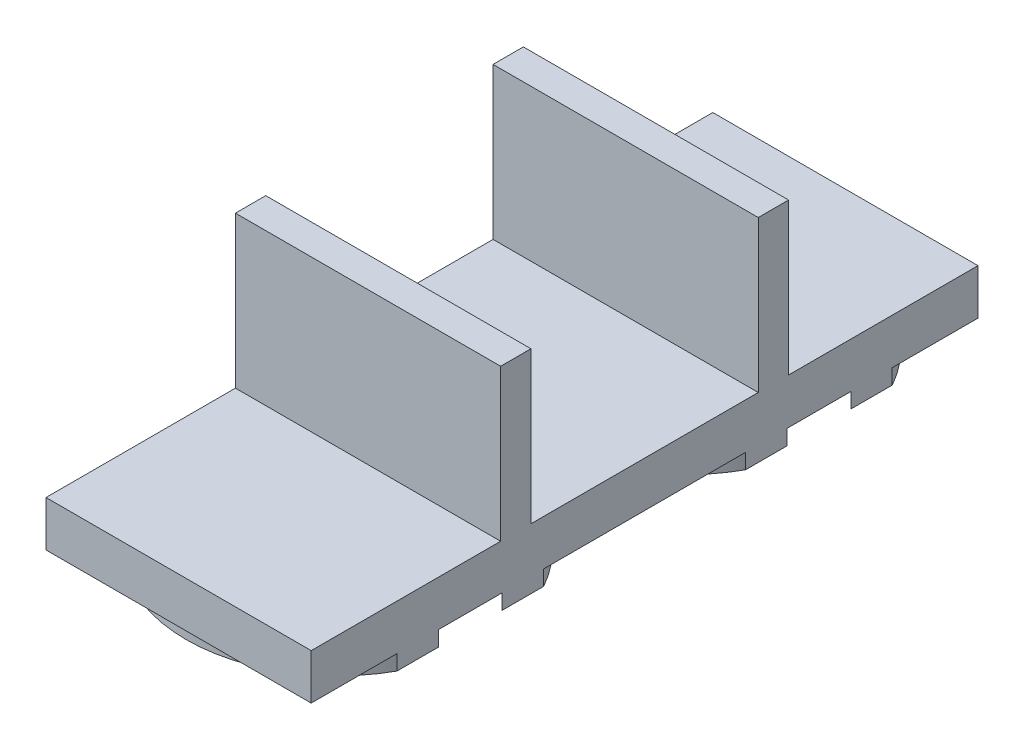
ISO-10303-21;
HEADER;
FILE_DESCRIPTION(('STEP AP214'),'2;1');
FILE_NAME('part.step','',(''),(''),'','','');
FILE_SCHEMA(('AUTOMOTIVE_DESIGN { 1 0 10303 214 1 1 1 1 }'));
ENDSEC;
DATA;
#1=APPLICATION_CONTEXT('core data for automotive mechanical design processes');
#2=APPLICATION_PROTOCOL_DEFINITION('international standard','automotive_design',2000,#1);
#3=PRODUCT_CONTEXT('',#1,'mechanical');
#4=PRODUCT('Part','Part','',(#3));
#5=PRODUCT_RELATED_PRODUCT_CATEGORY('part','',(#4));
#6=PRODUCT_DEFINITION_FORMATION('','',#4);
#7=PRODUCT_DEFINITION_CONTEXT('part definition',#1,'design');
#8=PRODUCT_DEFINITION('design','',#6,#7);
#9=PRODUCT_DEFINITION_SHAPE('','',#8);
#10=(LENGTH_UNIT() NAMED_UNIT(*) SI_UNIT(.MILLI.,.METRE.));
#11=(NAMED_UNIT(*) PLANE_ANGLE_UNIT() SI_UNIT($,.RADIAN.));
#12=(NAMED_UNIT(*) SI_UNIT($,.STERADIAN.) SOLID_ANGLE_UNIT());
#13=UNCERTAINTY_MEASURE_WITH_UNIT(LENGTH_MEASURE(1.E-05),#10,'distance_accuracy_value','');
#14=(GEOMETRIC_REPRESENTATION_CONTEXT(3) GLOBAL_UNCERTAINTY_ASSIGNED_CONTEXT((#13)) GLOBAL_UNIT_ASSIGNED_CONTEXT((#10,
#11,#12)) REPRESENTATION_CONTEXT('',''));
#15=CARTESIAN_POINT('',(0.,0.,0.));
#16=DIRECTION('',(0.,0.,1.));
#17=DIRECTION('',(1.,0.,0.));
#18=AXIS2_PLACEMENT_3D('',#15,#16,#17);
#19=CARTESIAN_POINT('',(35.,0.,44.));
#20=DIRECTION('',(0.,1.,0.));
#21=DIRECTION('',(0.,0.,1.));
#22=AXIS2_PLACEMENT_3D('',#19,#20,#21);
#23=PLANE('',#22);
#24=CARTESIAN_POINT('',(17.5,0.,-23.));
#25=DIRECTION('',(0.,-1.,0.));
#26=DIRECTION('',(0.,0.,-1.));
#27=AXIS2_PLACEMENT_3D('',#24,#25,#26);
#28=CIRCLE('',#27,20.);
#29=CARTESIAN_POINT('',(0.,0.,-32.6824583655186));
#30=VERTEX_POINT('',#29);
#31=CARTESIAN_POINT('',(35.,0.,-32.6824583655186));
#32=VERTEX_POINT('',#31);
#33=EDGE_CURVE('E417',#30,#32,#28,.T.);
#34=ORIENTED_EDGE('',*,*,#33,.F.);
#35=DIRECTION('',(0.,0.,-1.));
#36=VECTOR('',#35,1.);
#37=CARTESIAN_POINT('',(0.,0.,44.));
#38=LINE('',#37,#36);
#39=CARTESIAN_POINT('',(0.,0.,-44.));
#40=VERTEX_POINT('',#39);
#41=EDGE_CURVE('E247',#30,#40,#38,.T.);
#42=ORIENTED_EDGE('',*,*,#41,.T.);
#43=DIRECTION('',(-1.,0.,0.));
#44=VECTOR('',#43,1.);
#45=CARTESIAN_POINT('',(35.,0.,-44.));
#46=LINE('',#45,#44);
#47=CARTESIAN_POINT('',(35.,0.,-44.));
#48=VERTEX_POINT('',#47);
#49=EDGE_CURVE('E46',#48,#40,#46,.T.);
#50=ORIENTED_EDGE('',*,*,#49,.F.);
#51=DIRECTION('',(0.,0.,-1.));
#52=VECTOR('',#51,1.);
#53=CARTESIAN_POINT('',(35.,0.,44.));
#54=LINE('',#53,#52);
#55=EDGE_CURVE('E40',#32,#48,#54,.T.);
#56=ORIENTED_EDGE('',*,*,#55,.F.);
#57=EDGE_LOOP('',(#34,#42,#50,#56));
#58=FACE_BOUND('',#57,.T.);
#59=ADVANCED_FACE('F36',(#58),#23,.F.);
#60=CARTESIAN_POINT('',(17.5,0.,-23.));
#61=DIRECTION('',(0.,-1.,0.));
#62=DIRECTION('',(0.,0.,-1.));
#63=AXIS2_PLACEMENT_3D('',#60,#61,#62);
#64=CIRCLE('',#63,20.);
#65=CARTESIAN_POINT('',(35.,0.,-13.3175416344814));
#66=VERTEX_POINT('',#65);
#67=CARTESIAN_POINT('',(0.,0.,-13.3175416344814));
#68=VERTEX_POINT('',#67);
#69=EDGE_CURVE('E248',#66,#68,#64,.T.);
#70=ORIENTED_EDGE('',*,*,#69,.F.);
#71=CARTESIAN_POINT('',(35.,0.,13.3175416344814));
#72=VERTEX_POINT('',#71);
#73=EDGE_CURVE('E357',#72,#66,#54,.T.);
#74=ORIENTED_EDGE('',*,*,#73,.F.);
#75=CARTESIAN_POINT('',(17.5,0.,23.));
#76=DIRECTION('',(0.,-1.,0.));
#77=DIRECTION('',(0.,0.,-1.));
#78=AXIS2_PLACEMENT_3D('',#75,#76,#77);
#79=CIRCLE('',#78,20.);
#80=CARTESIAN_POINT('',(0.,0.,13.3175416344814));
#81=VERTEX_POINT('',#80);
#82=EDGE_CURVE('E281',#81,#72,#79,.T.);
#83=ORIENTED_EDGE('',*,*,#82,.F.);
#84=EDGE_CURVE('E352',#81,#68,#38,.T.);
#85=ORIENTED_EDGE('',*,*,#84,.T.);
#86=EDGE_LOOP('',(#70,#74,#83,#85));
#87=FACE_BOUND('',#86,.T.);
#88=ADVANCED_FACE('F540',(#87),#23,.F.);
#89=CARTESIAN_POINT('',(0.,0.,-18.7869251134118));
#90=VERTEX_POINT('',#89);
#91=CARTESIAN_POINT('',(0.,0.,-27.2130748865882));
#92=VERTEX_POINT('',#91);
#93=EDGE_CURVE('E356',#90,#92,#38,.T.);
#94=ORIENTED_EDGE('',*,*,#93,.T.);
#95=CARTESIAN_POINT('',(17.5,0.,-23.));
#96=DIRECTION('',(0.,-1.,0.));
#97=DIRECTION('',(0.,0.,-1.));
#98=AXIS2_PLACEMENT_3D('',#95,#96,#97);
#99=CIRCLE('',#98,18.);
#100=CARTESIAN_POINT('',(35.,0.,-27.2130748865882));
#101=VERTEX_POINT('',#100);
#102=EDGE_CURVE('E61',#92,#101,#99,.T.);
#103=ORIENTED_EDGE('',*,*,#102,.T.);
#104=CARTESIAN_POINT('',(35.,0.,-18.7869251134118));
#105=VERTEX_POINT('',#104);
#106=EDGE_CURVE('E373',#105,#101,#54,.T.);
#107=ORIENTED_EDGE('',*,*,#106,.F.);
#108=CARTESIAN_POINT('',(17.5,0.,-23.));
#109=DIRECTION('',(0.,-1.,0.));
#110=DIRECTION('',(0.,0.,-1.));
#111=AXIS2_PLACEMENT_3D('',#108,#109,#110);
#112=CIRCLE('',#111,18.);
#113=EDGE_CURVE('E251',#105,#90,#112,.T.);
#114=ORIENTED_EDGE('',*,*,#113,.T.);
#115=EDGE_LOOP('',(#94,#103,#107,#114));
#116=FACE_BOUND('',#115,.T.);
#117=ADVANCED_FACE('F412',(#116),#23,.F.);
#118=CARTESIAN_POINT('',(17.5,0.,23.));
#119=DIRECTION('',(0.,-1.,0.));
#120=DIRECTION('',(0.,0.,-1.));
#121=AXIS2_PLACEMENT_3D('',#118,#119,#120);
#122=CIRCLE('',#121,20.);
#123=CARTESIAN_POINT('',(35.,0.,32.6824583655186));
#124=VERTEX_POINT('',#123);
#125=CARTESIAN_POINT('',(0.,0.,32.6824583655186));
#126=VERTEX_POINT('',#125);
#127=EDGE_CURVE('E308',#124,#126,#122,.T.);
#128=ORIENTED_EDGE('',*,*,#127,.F.);
#129=CARTESIAN_POINT('',(35.,0.,44.));
#130=VERTEX_POINT('',#129);
#131=EDGE_CURVE('E383',#130,#124,#54,.T.);
#132=ORIENTED_EDGE('',*,*,#131,.F.);
#133=DIRECTION('',(-1.,0.,0.));
#134=VECTOR('',#133,1.);
#135=CARTESIAN_POINT('',(35.,0.,44.));
#136=LINE('',#135,#134);
#137=CARTESIAN_POINT('',(0.,0.,44.));
#138=VERTEX_POINT('',#137);
#139=EDGE_CURVE('E11',#130,#138,#136,.T.);
#140=ORIENTED_EDGE('',*,*,#139,.T.);
#141=EDGE_CURVE('E371',#138,#126,#38,.T.);
#142=ORIENTED_EDGE('',*,*,#141,.T.);
#143=EDGE_LOOP('',(#128,#132,#140,#142));
#144=FACE_BOUND('',#143,.T.);
#145=ADVANCED_FACE('F514',(#144),#23,.F.);
#146=CARTESIAN_POINT('',(35.,6.,44.));
#147=DIRECTION('',(0.,0.,-1.));
#148=DIRECTION('',(-1.,0.,0.));
#149=AXIS2_PLACEMENT_3D('',#146,#147,#148);
#150=PLANE('',#149);
#151=DIRECTION('',(0.,-1.,0.));
#152=VECTOR('',#151,1.);
#153=CARTESIAN_POINT('',(0.,6.,44.));
#154=LINE('',#153,#152);
#155=CARTESIAN_POINT('',(0.,6.,44.));
#156=VERTEX_POINT('',#155);
#157=EDGE_CURVE('E340',#156,#138,#154,.T.);
#158=ORIENTED_EDGE('',*,*,#157,.T.);
#159=ORIENTED_EDGE('',*,*,#139,.F.);
#160=DIRECTION('',(0.,-1.,0.));
#161=VECTOR('',#160,1.);
#162=CARTESIAN_POINT('',(35.,6.,44.));
#163=LINE('',#162,#161);
#164=CARTESIAN_POINT('',(35.,6.,44.));
#165=VERTEX_POINT('',#164);
#166=EDGE_CURVE('E376',#165,#130,#163,.T.);
#167=ORIENTED_EDGE('',*,*,#166,.F.);
#168=DIRECTION('',(-1.,0.,0.));
#169=VECTOR('',#168,1.);
#170=CARTESIAN_POINT('',(35.,6.,44.));
#171=LINE('',#170,#169);
#172=EDGE_CURVE('E454',#165,#156,#171,.T.);
#173=ORIENTED_EDGE('',*,*,#172,.T.);
#174=EDGE_LOOP('',(#158,#159,#167,#173));
#175=FACE_BOUND('',#174,.T.);
#176=ADVANCED_FACE('F38',(#175),#150,.F.);
#177=CARTESIAN_POINT('',(0.,0.,27.2130748865883));
#178=VERTEX_POINT('',#177);
#179=CARTESIAN_POINT('',(0.,0.,18.7869251134117));
#180=VERTEX_POINT('',#179);
#181=EDGE_CURVE('E355',#178,#180,#38,.T.);
#182=ORIENTED_EDGE('',*,*,#181,.T.);
#183=CARTESIAN_POINT('',(17.5,0.,23.));
#184=DIRECTION('',(0.,-1.,0.));
#185=DIRECTION('',(0.,0.,-1.));
#186=AXIS2_PLACEMENT_3D('',#183,#184,#185);
#187=CIRCLE('',#186,18.);
#188=CARTESIAN_POINT('',(35.,0.,18.7869251134117));
#189=VERTEX_POINT('',#188);
#190=EDGE_CURVE('E286',#180,#189,#187,.T.);
#191=ORIENTED_EDGE('',*,*,#190,.T.);
#192=CARTESIAN_POINT('',(35.,0.,27.2130748865883));
#193=VERTEX_POINT('',#192);
#194=EDGE_CURVE('E329',#193,#189,#54,.T.);
#195=ORIENTED_EDGE('',*,*,#194,.F.);
#196=CARTESIAN_POINT('',(17.5,0.,23.));
#197=DIRECTION('',(0.,-1.,0.));
#198=DIRECTION('',(0.,0.,-1.));
#199=AXIS2_PLACEMENT_3D('',#196,#197,#198);
#200=CIRCLE('',#199,18.);
#201=EDGE_CURVE('E313',#193,#178,#200,.T.);
#202=ORIENTED_EDGE('',*,*,#201,.T.);
#203=EDGE_LOOP('',(#182,#191,#195,#202));
#204=FACE_BOUND('',#203,.T.);
#205=ADVANCED_FACE('F529',(#204),#23,.F.);
#206=CARTESIAN_POINT('',(35.,0.,-44.));
#207=DIRECTION('',(0.,0.,1.));
#208=DIRECTION('',(1.,0.,0.));
#209=AXIS2_PLACEMENT_3D('',#206,#207,#208);
#210=PLANE('',#209);
#211=DIRECTION('',(0.,1.,0.));
#212=VECTOR('',#211,1.);
#213=CARTESIAN_POINT('',(0.,0.,-44.));
#214=LINE('',#213,#212);
#215=CARTESIAN_POINT('',(0.,6.00000000000002,-44.));
#216=VERTEX_POINT('',#215);
#217=EDGE_CURVE('E363',#40,#216,#214,.T.);
#218=ORIENTED_EDGE('',*,*,#217,.T.);
#219=DIRECTION('',(-1.,0.,0.));
#220=VECTOR('',#219,1.);
#221=CARTESIAN_POINT('',(35.,6.00000000000002,-44.));
#222=LINE('',#221,#220);
#223=CARTESIAN_POINT('',(35.,6.00000000000002,-44.));
#224=VERTEX_POINT('',#223);
#225=EDGE_CURVE('E426',#224,#216,#222,.T.);
#226=ORIENTED_EDGE('',*,*,#225,.F.);
#227=DIRECTION('',(0.,1.,0.));
#228=VECTOR('',#227,1.);
#229=CARTESIAN_POINT('',(35.,0.,-44.));
#230=LINE('',#229,#228);
#231=EDGE_CURVE('E377',#48,#224,#230,.T.);
#232=ORIENTED_EDGE('',*,*,#231,.F.);
#233=ORIENTED_EDGE('',*,*,#49,.T.);
#234=EDGE_LOOP('',(#218,#226,#232,#233));
#235=FACE_BOUND('',#234,.T.);
#236=ADVANCED_FACE('F428',(#235),#210,.F.);
#237=CARTESIAN_POINT('',(35.,6.00000000000002,-44.));
#238=DIRECTION('',(0.,-1.,0.));
#239=DIRECTION('',(0.,0.,-1.));
#240=AXIS2_PLACEMENT_3D('',#237,#238,#239);
#241=PLANE('',#240);
#242=DIRECTION('',(0.,0.,1.));
#243=VECTOR('',#242,1.);
#244=CARTESIAN_POINT('',(0.,6.00000000000002,-44.));
#245=LINE('',#244,#243);
#246=CARTESIAN_POINT('',(0.,6.00000000000001,-19.));
#247=VERTEX_POINT('',#246);
#248=EDGE_CURVE('E493',#216,#247,#245,.T.);
#249=ORIENTED_EDGE('',*,*,#248,.T.);
#250=DIRECTION('',(-1.,0.,0.));
#251=VECTOR('',#250,1.);
#252=CARTESIAN_POINT('',(35.,6.00000000000001,-19.));
#253=LINE('',#252,#251);
#254=CARTESIAN_POINT('',(35.,6.00000000000001,-19.));
#255=VERTEX_POINT('',#254);
#256=EDGE_CURVE('E433',#255,#247,#253,.T.);
#257=ORIENTED_EDGE('',*,*,#256,.F.);
#258=DIRECTION('',(0.,0.,1.));
#259=VECTOR('',#258,1.);
#260=CARTESIAN_POINT('',(35.,6.00000000000002,-44.));
#261=LINE('',#260,#259);
#262=EDGE_CURVE('E388',#224,#255,#261,.T.);
#263=ORIENTED_EDGE('',*,*,#262,.F.);
#264=ORIENTED_EDGE('',*,*,#225,.T.);
#265=EDGE_LOOP('',(#249,#257,#263,#264));
#266=FACE_BOUND('',#265,.T.);
#267=ADVANCED_FACE('F436',(#266),#241,.F.);
#268=CARTESIAN_POINT('',(35.,6.00000000000001,-19.));
#269=DIRECTION('',(0.,0.,1.));
#270=DIRECTION('',(0.,-1.,0.));
#271=AXIS2_PLACEMENT_3D('',#268,#269,#270);
#272=PLANE('',#271);
#273=DIRECTION('',(0.,1.,0.));
#274=VECTOR('',#273,1.);
#275=CARTESIAN_POINT('',(0.,6.00000000000001,-19.));
#276=LINE('',#275,#274);
#277=CARTESIAN_POINT('',(0.,26.,-19.));
#278=VERTEX_POINT('',#277);
#279=EDGE_CURVE('E491',#247,#278,#276,.T.);
#280=ORIENTED_EDGE('',*,*,#279,.T.);
#281=DIRECTION('',(-1.,0.,0.));
#282=VECTOR('',#281,1.);
#283=CARTESIAN_POINT('',(35.,26.,-19.));
#284=LINE('',#283,#282);
#285=CARTESIAN_POINT('',(35.,26.,-19.));
#286=VERTEX_POINT('',#285);
#287=EDGE_CURVE('E484',#286,#278,#284,.T.);
#288=ORIENTED_EDGE('',*,*,#287,.F.);
#289=DIRECTION('',(0.,1.,0.));
#290=VECTOR('',#289,1.);
#291=CARTESIAN_POINT('',(35.,6.00000000000001,-19.));
#292=LINE('',#291,#290);
#293=EDGE_CURVE('E439',#255,#286,#292,.T.);
#294=ORIENTED_EDGE('',*,*,#293,.F.);
#295=ORIENTED_EDGE('',*,*,#256,.T.);
#296=EDGE_LOOP('',(#280,#288,#294,#295));
#297=FACE_BOUND('',#296,.T.);
#298=ADVANCED_FACE('F489',(#297),#272,.F.);
#299=CARTESIAN_POINT('',(35.,26.,-19.));
#300=DIRECTION('',(0.,-1.,0.));
#301=DIRECTION('',(0.,0.,-1.));
#302=AXIS2_PLACEMENT_3D('',#299,#300,#301);
#303=PLANE('',#302);
#304=DIRECTION('',(0.,0.,1.));
#305=VECTOR('',#304,1.);
#306=CARTESIAN_POINT('',(0.,26.,-19.));
#307=LINE('',#306,#305);
#308=CARTESIAN_POINT('',(0.,26.,-15.));
#309=VERTEX_POINT('',#308);
#310=EDGE_CURVE('E495',#278,#309,#307,.T.);
#311=ORIENTED_EDGE('',*,*,#310,.T.);
#312=DIRECTION('',(-1.,0.,0.));
#313=VECTOR('',#312,1.);
#314=CARTESIAN_POINT('',(35.,26.,-15.));
#315=LINE('',#314,#313);
#316=CARTESIAN_POINT('',(35.,26.,-15.));
#317=VERTEX_POINT('',#316);
#318=EDGE_CURVE('E481',#317,#309,#315,.T.);
#319=ORIENTED_EDGE('',*,*,#318,.F.);
#320=DIRECTION('',(0.,0.,1.));
#321=VECTOR('',#320,1.);
#322=CARTESIAN_POINT('',(35.,26.,-19.));
#323=LINE('',#322,#321);
#324=EDGE_CURVE('E440',#286,#317,#323,.T.);
#325=ORIENTED_EDGE('',*,*,#324,.F.);
#326=ORIENTED_EDGE('',*,*,#287,.T.);
#327=EDGE_LOOP('',(#311,#319,#325,#326));
#328=FACE_BOUND('',#327,.T.);
#329=ADVANCED_FACE('F554',(#328),#303,.F.);
#330=CARTESIAN_POINT('',(35.,26.,-15.));
#331=DIRECTION('',(0.,0.,-1.));
#332=DIRECTION('',(0.,1.,0.));
#333=AXIS2_PLACEMENT_3D('',#330,#331,#332);
#334=PLANE('',#333);
#335=DIRECTION('',(0.,-1.,0.));
#336=VECTOR('',#335,1.);
#337=CARTESIAN_POINT('',(0.,26.,-15.));
#338=LINE('',#337,#336);
#339=CARTESIAN_POINT('',(0.,6.,-15.));
#340=VERTEX_POINT('',#339);
#341=EDGE_CURVE('E497',#309,#340,#338,.T.);
#342=ORIENTED_EDGE('',*,*,#341,.T.);
#343=DIRECTION('',(-1.,0.,0.));
#344=VECTOR('',#343,1.);
#345=CARTESIAN_POINT('',(35.,6.,-15.));
#346=LINE('',#345,#344);
#347=CARTESIAN_POINT('',(35.,6.,-15.));
#348=VERTEX_POINT('',#347);
#349=EDGE_CURVE('E478',#348,#340,#346,.T.);
#350=ORIENTED_EDGE('',*,*,#349,.F.);
#351=DIRECTION('',(0.,-1.,0.));
#352=VECTOR('',#351,1.);
#353=CARTESIAN_POINT('',(35.,26.,-15.));
#354=LINE('',#353,#352);
#355=EDGE_CURVE('E444',#317,#348,#354,.T.);
#356=ORIENTED_EDGE('',*,*,#355,.F.);
#357=ORIENTED_EDGE('',*,*,#318,.T.);
#358=EDGE_LOOP('',(#342,#350,#356,#357));
#359=FACE_BOUND('',#358,.T.);
#360=ADVANCED_FACE('F557',(#359),#334,.F.);
#361=CARTESIAN_POINT('',(35.,6.,-15.));
#362=DIRECTION('',(0.,-1.,0.));
#363=DIRECTION('',(0.,0.,-1.));
#364=AXIS2_PLACEMENT_3D('',#361,#362,#363);
#365=PLANE('',#364);
#366=DIRECTION('',(0.,0.,1.));
#367=VECTOR('',#366,1.);
#368=CARTESIAN_POINT('',(0.,6.,-15.));
#369=LINE('',#368,#367);
#370=CARTESIAN_POINT('',(0.,6.,15.));
#371=VERTEX_POINT('',#370);
#372=EDGE_CURVE('E501',#340,#371,#369,.T.);
#373=ORIENTED_EDGE('',*,*,#372,.T.);
#374=DIRECTION('',(-1.,0.,0.));
#375=VECTOR('',#374,1.);
#376=CARTESIAN_POINT('',(35.,6.,15.));
#377=LINE('',#376,#375);
#378=CARTESIAN_POINT('',(35.,6.,15.));
#379=VERTEX_POINT('',#378);
#380=EDGE_CURVE('E475',#379,#371,#377,.T.);
#381=ORIENTED_EDGE('',*,*,#380,.F.);
#382=DIRECTION('',(0.,0.,1.));
#383=VECTOR('',#382,1.);
#384=CARTESIAN_POINT('',(35.,6.,-15.));
#385=LINE('',#384,#383);
#386=EDGE_CURVE('E446',#348,#379,#385,.T.);
#387=ORIENTED_EDGE('',*,*,#386,.F.);
#388=ORIENTED_EDGE('',*,*,#349,.T.);
#389=EDGE_LOOP('',(#373,#381,#387,#388));
#390=FACE_BOUND('',#389,.T.);
#391=ADVANCED_FACE('F561',(#390),#365,.F.);
#392=CARTESIAN_POINT('',(35.,6.,15.));
#393=DIRECTION('',(0.,0.,1.));
#394=DIRECTION('',(0.,-1.,0.));
#395=AXIS2_PLACEMENT_3D('',#392,#393,#394);
#396=PLANE('',#395);
#397=DIRECTION('',(0.,1.,0.));
#398=VECTOR('',#397,1.);
#399=CARTESIAN_POINT('',(0.,6.,15.));
#400=LINE('',#399,#398);
#401=CARTESIAN_POINT('',(0.,26.,15.));
#402=VERTEX_POINT('',#401);
#403=EDGE_CURVE('E503',#371,#402,#400,.T.);
#404=ORIENTED_EDGE('',*,*,#403,.T.);
#405=DIRECTION('',(-1.,0.,0.));
#406=VECTOR('',#405,1.);
#407=CARTESIAN_POINT('',(35.,26.,15.));
#408=LINE('',#407,#406);
#409=CARTESIAN_POINT('',(35.,26.,15.));
#410=VERTEX_POINT('',#409);
#411=EDGE_CURVE('E472',#410,#402,#408,.T.);
#412=ORIENTED_EDGE('',*,*,#411,.F.);
#413=DIRECTION('',(0.,1.,0.));
#414=VECTOR('',#413,1.);
#415=CARTESIAN_POINT('',(35.,6.,15.));
#416=LINE('',#415,#414);
#417=EDGE_CURVE('E448',#379,#410,#416,.T.);
#418=ORIENTED_EDGE('',*,*,#417,.F.);
#419=ORIENTED_EDGE('',*,*,#380,.T.);
#420=EDGE_LOOP('',(#404,#412,#418,#419));
#421=FACE_BOUND('',#420,.T.);
#422=ADVANCED_FACE('F565',(#421),#396,.F.);
#423=CARTESIAN_POINT('',(35.,26.,15.));
#424=DIRECTION('',(0.,-1.,0.));
#425=DIRECTION('',(0.,0.,-1.));
#426=AXIS2_PLACEMENT_3D('',#423,#424,#425);
#427=PLANE('',#426);
#428=DIRECTION('',(0.,0.,1.));
#429=VECTOR('',#428,1.);
#430=CARTESIAN_POINT('',(0.,26.,15.));
#431=LINE('',#430,#429);
#432=CARTESIAN_POINT('',(0.,26.,19.));
#433=VERTEX_POINT('',#432);
#434=EDGE_CURVE('E505',#402,#433,#431,.T.);
#435=ORIENTED_EDGE('',*,*,#434,.T.);
#436=DIRECTION('',(-1.,0.,0.));
#437=VECTOR('',#436,1.);
#438=CARTESIAN_POINT('',(35.,26.,19.));
#439=LINE('',#438,#437);
#440=CARTESIAN_POINT('',(35.,26.,19.));
#441=VERTEX_POINT('',#440);
#442=EDGE_CURVE('E464',#441,#433,#439,.T.);
#443=ORIENTED_EDGE('',*,*,#442,.F.);
#444=DIRECTION('',(0.,0.,1.));
#445=VECTOR('',#444,1.);
#446=CARTESIAN_POINT('',(35.,26.,15.));
#447=LINE('',#446,#445);
#448=EDGE_CURVE('E450',#410,#441,#447,.T.);
#449=ORIENTED_EDGE('',*,*,#448,.F.);
#450=ORIENTED_EDGE('',*,*,#411,.T.);
#451=EDGE_LOOP('',(#435,#443,#449,#450));
#452=FACE_BOUND('',#451,.T.);
#453=ADVANCED_FACE('F569',(#452),#427,.F.);
#454=CARTESIAN_POINT('',(35.,26.,19.));
#455=DIRECTION('',(0.,0.,-1.));
#456=DIRECTION('',(0.,1.,0.));
#457=AXIS2_PLACEMENT_3D('',#454,#455,#456);
#458=PLANE('',#457);
#459=DIRECTION('',(0.,-1.,0.));
#460=VECTOR('',#459,1.);
#461=CARTESIAN_POINT('',(0.,26.,19.));
#462=LINE('',#461,#460);
#463=CARTESIAN_POINT('',(0.,6.,19.));
#464=VERTEX_POINT('',#463);
#465=EDGE_CURVE('E506',#433,#464,#462,.T.);
#466=ORIENTED_EDGE('',*,*,#465,.T.);
#467=DIRECTION('',(-1.,0.,0.));
#468=VECTOR('',#467,1.);
#469=CARTESIAN_POINT('',(35.,6.,19.));
#470=LINE('',#469,#468);
#471=CARTESIAN_POINT('',(35.,6.,19.));
#472=VERTEX_POINT('',#471);
#473=EDGE_CURVE('E458',#472,#464,#470,.T.);
#474=ORIENTED_EDGE('',*,*,#473,.F.);
#475=DIRECTION('',(0.,-1.,0.));
#476=VECTOR('',#475,1.);
#477=CARTESIAN_POINT('',(35.,26.,19.));
#478=LINE('',#477,#476);
#479=EDGE_CURVE('E452',#441,#472,#478,.T.);
#480=ORIENTED_EDGE('',*,*,#479,.F.);
#481=ORIENTED_EDGE('',*,*,#442,.T.);
#482=EDGE_LOOP('',(#466,#474,#480,#481));
#483=FACE_BOUND('',#482,.T.);
#484=ADVANCED_FACE('F573',(#483),#458,.F.);
#485=CARTESIAN_POINT('',(35.,6.,19.));
#486=DIRECTION('',(0.,-1.,0.));
#487=DIRECTION('',(0.,0.,-1.));
#488=AXIS2_PLACEMENT_3D('',#485,#486,#487);
#489=PLANE('',#488);
#490=DIRECTION('',(0.,0.,1.));
#491=VECTOR('',#490,1.);
#492=CARTESIAN_POINT('',(0.,6.,19.));
#493=LINE('',#492,#491);
#494=EDGE_CURVE('E467',#464,#156,#493,.T.);
#495=ORIENTED_EDGE('',*,*,#494,.T.);
#496=ORIENTED_EDGE('',*,*,#172,.F.);
#497=DIRECTION('',(0.,0.,1.));
#498=VECTOR('',#497,1.);
#499=CARTESIAN_POINT('',(35.,6.,19.));
#500=LINE('',#499,#498);
#501=EDGE_CURVE('E453',#472,#165,#500,.T.);
#502=ORIENTED_EDGE('',*,*,#501,.F.);
#503=ORIENTED_EDGE('',*,*,#473,.T.);
#504=EDGE_LOOP('',(#495,#496,#502,#503));
#505=FACE_BOUND('',#504,.T.);
#506=ADVANCED_FACE('F577',(#505),#489,.F.);
#507=CARTESIAN_POINT('',(35.,0.,0.));
#508=DIRECTION('',(1.,0.,0.));
#509=DIRECTION('',(0.,0.,-1.));
#510=AXIS2_PLACEMENT_3D('',#507,#508,#509);
#511=PLANE('',#510);
#512=ORIENTED_EDGE('',*,*,#166,.T.);
#513=ORIENTED_EDGE('',*,*,#131,.T.);
#514=DIRECTION('',(0.,1.,0.));
#515=VECTOR('',#514,1.);
#516=CARTESIAN_POINT('',(35.,-2.,32.6824583655186));
#517=LINE('',#516,#515);
#518=CARTESIAN_POINT('',(35.,-2.,32.6824583655186));
#519=VERTEX_POINT('',#518);
#520=EDGE_CURVE('E334',#519,#124,#517,.T.);
#521=ORIENTED_EDGE('',*,*,#520,.F.);
#522=DIRECTION('',(0.,0.,1.));
#523=VECTOR('',#522,1.);
#524=CARTESIAN_POINT('',(35.,-2.,0.));
#525=LINE('',#524,#523);
#526=CARTESIAN_POINT('',(35.,-2.,27.2130748865883));
#527=VERTEX_POINT('',#526);
#528=EDGE_CURVE('E309',#527,#519,#525,.T.);
#529=ORIENTED_EDGE('',*,*,#528,.F.);
#530=DIRECTION('',(0.,1.,0.));
#531=VECTOR('',#530,1.);
#532=CARTESIAN_POINT('',(35.,-2.,27.2130748865883));
#533=LINE('',#532,#531);
#534=EDGE_CURVE('E320',#527,#193,#533,.T.);
#535=ORIENTED_EDGE('',*,*,#534,.T.);
#536=ORIENTED_EDGE('',*,*,#194,.T.);
#537=DIRECTION('',(0.,1.,0.));
#538=VECTOR('',#537,1.);
#539=CARTESIAN_POINT('',(35.,-2.,18.7869251134117));
#540=LINE('',#539,#538);
#541=CARTESIAN_POINT('',(35.,-2.,18.7869251134117));
#542=VERTEX_POINT('',#541);
#543=EDGE_CURVE('E299',#542,#189,#540,.T.);
#544=ORIENTED_EDGE('',*,*,#543,.F.);
#545=DIRECTION('',(0.,0.,1.));
#546=VECTOR('',#545,1.);
#547=CARTESIAN_POINT('',(35.,-2.,0.));
#548=LINE('',#547,#546);
#549=CARTESIAN_POINT('',(35.,-2.,13.3175416344814));
#550=VERTEX_POINT('',#549);
#551=EDGE_CURVE('E288',#550,#542,#548,.T.);
#552=ORIENTED_EDGE('',*,*,#551,.F.);
#553=DIRECTION('',(0.,1.,0.));
#554=VECTOR('',#553,1.);
#555=CARTESIAN_POINT('',(35.,-2.,13.3175416344814));
#556=LINE('',#555,#554);
#557=EDGE_CURVE('E302',#550,#72,#556,.T.);
#558=ORIENTED_EDGE('',*,*,#557,.T.);
#559=ORIENTED_EDGE('',*,*,#73,.T.);
#560=DIRECTION('',(0.,1.,0.));
#561=VECTOR('',#560,1.);
#562=CARTESIAN_POINT('',(35.,-2.,-13.3175416344814));
#563=LINE('',#562,#561);
#564=CARTESIAN_POINT('',(35.,-2.,-13.3175416344814));
#565=VERTEX_POINT('',#564);
#566=EDGE_CURVE('E278',#565,#66,#563,.T.);
#567=ORIENTED_EDGE('',*,*,#566,.F.);
#568=DIRECTION('',(0.,0.,1.));
#569=VECTOR('',#568,1.);
#570=CARTESIAN_POINT('',(35.,-2.,0.));
#571=LINE('',#570,#569);
#572=CARTESIAN_POINT('',(35.,-2.,-18.7869251134117));
#573=VERTEX_POINT('',#572);
#574=EDGE_CURVE('E257',#573,#565,#571,.T.);
#575=ORIENTED_EDGE('',*,*,#574,.F.);
#576=DIRECTION('',(0.,1.,0.));
#577=VECTOR('',#576,1.);
#578=CARTESIAN_POINT('',(35.,-2.,-18.7869251134117));
#579=LINE('',#578,#577);
#580=EDGE_CURVE('E266',#573,#105,#579,.T.);
#581=ORIENTED_EDGE('',*,*,#580,.T.);
#582=ORIENTED_EDGE('',*,*,#106,.T.);
#583=DIRECTION('',(0.,1.,0.));
#584=VECTOR('',#583,1.);
#585=CARTESIAN_POINT('',(35.,-2.,-27.2130748865883));
#586=LINE('',#585,#584);
#587=CARTESIAN_POINT('',(35.,-2.,-27.2130748865883));
#588=VERTEX_POINT('',#587);
#589=EDGE_CURVE('E253',#588,#101,#586,.T.);
#590=ORIENTED_EDGE('',*,*,#589,.F.);
#591=DIRECTION('',(0.,0.,1.));
#592=VECTOR('',#591,1.);
#593=CARTESIAN_POINT('',(35.,-2.,0.));
#594=LINE('',#593,#592);
#595=CARTESIAN_POINT('',(35.,-2.,-32.6824583655186));
#596=VERTEX_POINT('',#595);
#597=EDGE_CURVE('E233',#596,#588,#594,.T.);
#598=ORIENTED_EDGE('',*,*,#597,.F.);
#599=DIRECTION('',(0.,1.,0.));
#600=VECTOR('',#599,1.);
#601=CARTESIAN_POINT('',(35.,-2.,-32.6824583655186));
#602=LINE('',#601,#600);
#603=EDGE_CURVE('E230',#596,#32,#602,.T.);
#604=ORIENTED_EDGE('',*,*,#603,.T.);
#605=ORIENTED_EDGE('',*,*,#55,.T.);
#606=ORIENTED_EDGE('',*,*,#231,.T.);
#607=ORIENTED_EDGE('',*,*,#262,.T.);
#608=ORIENTED_EDGE('',*,*,#293,.T.);
#609=ORIENTED_EDGE('',*,*,#324,.T.);
#610=ORIENTED_EDGE('',*,*,#355,.T.);
#611=ORIENTED_EDGE('',*,*,#386,.T.);
#612=ORIENTED_EDGE('',*,*,#417,.T.);
#613=ORIENTED_EDGE('',*,*,#448,.T.);
#614=ORIENTED_EDGE('',*,*,#479,.T.);
#615=ORIENTED_EDGE('',*,*,#501,.T.);
#616=EDGE_LOOP('',(#512,#513,#521,#529,#535,#536,#544,#552,#558,#559,#567,#575,#581,#582,#590,
#598,#604,#605,#606,#607,#608,#609,#610,#611,#612,#613,#614,#615));
#617=FACE_BOUND('',#616,.T.);
#618=ADVANCED_FACE('F393',(#617),#511,.T.);
#619=CARTESIAN_POINT('',(0.,0.,0.));
#620=DIRECTION('',(1.,0.,0.));
#621=DIRECTION('',(0.,0.,-1.));
#622=AXIS2_PLACEMENT_3D('',#619,#620,#621);
#623=PLANE('',#622);
#624=ORIENTED_EDGE('',*,*,#157,.F.);
#625=ORIENTED_EDGE('',*,*,#494,.F.);
#626=ORIENTED_EDGE('',*,*,#465,.F.);
#627=ORIENTED_EDGE('',*,*,#434,.F.);
#628=ORIENTED_EDGE('',*,*,#403,.F.);
#629=ORIENTED_EDGE('',*,*,#372,.F.);
#630=ORIENTED_EDGE('',*,*,#341,.F.);
#631=ORIENTED_EDGE('',*,*,#310,.F.);
#632=ORIENTED_EDGE('',*,*,#279,.F.);
#633=ORIENTED_EDGE('',*,*,#248,.F.);
#634=ORIENTED_EDGE('',*,*,#217,.F.);
#635=ORIENTED_EDGE('',*,*,#41,.F.);
#636=DIRECTION('',(0.,1.,0.));
#637=VECTOR('',#636,1.);
#638=CARTESIAN_POINT('',(0.,-2.,-32.6824583655186));
#639=LINE('',#638,#637);
#640=CARTESIAN_POINT('',(0.,-2.,-32.6824583655186));
#641=VERTEX_POINT('',#640);
#642=EDGE_CURVE('E228',#641,#30,#639,.T.);
#643=ORIENTED_EDGE('',*,*,#642,.F.);
#644=DIRECTION('',(0.,0.,-1.));
#645=VECTOR('',#644,1.);
#646=CARTESIAN_POINT('',(0.,-2.,0.));
#647=LINE('',#646,#645);
#648=CARTESIAN_POINT('',(0.,-2.,-27.2130748865882));
#649=VERTEX_POINT('',#648);
#650=EDGE_CURVE('E234',#649,#641,#647,.T.);
#651=ORIENTED_EDGE('',*,*,#650,.F.);
#652=DIRECTION('',(0.,1.,0.));
#653=VECTOR('',#652,1.);
#654=CARTESIAN_POINT('',(0.,-2.,-27.2130748865882));
#655=LINE('',#654,#653);
#656=EDGE_CURVE('E413',#649,#92,#655,.T.);
#657=ORIENTED_EDGE('',*,*,#656,.T.);
#658=ORIENTED_EDGE('',*,*,#93,.F.);
#659=DIRECTION('',(0.,1.,0.));
#660=VECTOR('',#659,1.);
#661=CARTESIAN_POINT('',(0.,-2.,-18.7869251134118));
#662=LINE('',#661,#660);
#663=CARTESIAN_POINT('',(0.,-2.,-18.7869251134118));
#664=VERTEX_POINT('',#663);
#665=EDGE_CURVE('E272',#664,#90,#662,.T.);
#666=ORIENTED_EDGE('',*,*,#665,.F.);
#667=DIRECTION('',(0.,0.,-1.));
#668=VECTOR('',#667,1.);
#669=CARTESIAN_POINT('',(0.,-2.,0.));
#670=LINE('',#669,#668);
#671=CARTESIAN_POINT('',(0.,-2.,-13.3175416344814));
#672=VERTEX_POINT('',#671);
#673=EDGE_CURVE('E262',#672,#664,#670,.T.);
#674=ORIENTED_EDGE('',*,*,#673,.F.);
#675=DIRECTION('',(0.,1.,0.));
#676=VECTOR('',#675,1.);
#677=CARTESIAN_POINT('',(0.,-2.,-13.3175416344814));
#678=LINE('',#677,#676);
#679=EDGE_CURVE('E275',#672,#68,#678,.T.);
#680=ORIENTED_EDGE('',*,*,#679,.T.);
#681=ORIENTED_EDGE('',*,*,#84,.F.);
#682=DIRECTION('',(0.,1.,0.));
#683=VECTOR('',#682,1.);
#684=CARTESIAN_POINT('',(0.,-2.,13.3175416344814));
#685=LINE('',#684,#683);
#686=CARTESIAN_POINT('',(0.,-2.,13.3175416344814));
#687=VERTEX_POINT('',#686);
#688=EDGE_CURVE('E305',#687,#81,#685,.T.);
#689=ORIENTED_EDGE('',*,*,#688,.F.);
#690=DIRECTION('',(0.,0.,-1.));
#691=VECTOR('',#690,1.);
#692=CARTESIAN_POINT('',(0.,-2.,0.));
#693=LINE('',#692,#691);
#694=CARTESIAN_POINT('',(0.,-2.,18.7869251134117));
#695=VERTEX_POINT('',#694);
#696=EDGE_CURVE('E282',#695,#687,#693,.T.);
#697=ORIENTED_EDGE('',*,*,#696,.F.);
#698=DIRECTION('',(0.,1.,0.));
#699=VECTOR('',#698,1.);
#700=CARTESIAN_POINT('',(0.,-2.,18.7869251134117));
#701=LINE('',#700,#699);
#702=EDGE_CURVE('E293',#695,#180,#701,.T.);
#703=ORIENTED_EDGE('',*,*,#702,.T.);
#704=ORIENTED_EDGE('',*,*,#181,.F.);
#705=DIRECTION('',(0.,1.,0.));
#706=VECTOR('',#705,1.);
#707=CARTESIAN_POINT('',(0.,-2.,27.2130748865883));
#708=LINE('',#707,#706);
#709=CARTESIAN_POINT('',(0.,-2.,27.2130748865883));
#710=VERTEX_POINT('',#709);
#711=EDGE_CURVE('E335',#710,#178,#708,.T.);
#712=ORIENTED_EDGE('',*,*,#711,.F.);
#713=DIRECTION('',(0.,0.,-1.));
#714=VECTOR('',#713,1.);
#715=CARTESIAN_POINT('',(0.,-2.,0.));
#716=LINE('',#715,#714);
#717=CARTESIAN_POINT('',(0.,-2.,32.6824583655186));
#718=VERTEX_POINT('',#717);
#719=EDGE_CURVE('E315',#718,#710,#716,.T.);
#720=ORIENTED_EDGE('',*,*,#719,.F.);
#721=DIRECTION('',(0.,1.,0.));
#722=VECTOR('',#721,1.);
#723=CARTESIAN_POINT('',(0.,-2.,32.6824583655186));
#724=LINE('',#723,#722);
#725=EDGE_CURVE('E331',#718,#126,#724,.T.);
#726=ORIENTED_EDGE('',*,*,#725,.T.);
#727=ORIENTED_EDGE('',*,*,#141,.F.);
#728=EDGE_LOOP('',(#624,#625,#626,#627,#628,#629,#630,#631,#632,#633,#634,#635,#643,#651,#657,
#658,#666,#674,#680,#681,#689,#697,#703,#704,#712,#720,#726,#727));
#729=FACE_BOUND('',#728,.T.);
#730=ADVANCED_FACE('F245',(#729),#623,.F.);
#731=CARTESIAN_POINT('',(17.5,-2.,23.));
#732=DIRECTION('',(0.,1.,0.));
#733=DIRECTION('',(0.,0.,1.));
#734=AXIS2_PLACEMENT_3D('',#731,#732,#733);
#735=CYLINDRICAL_SURFACE('',#734,20.);
#736=ORIENTED_EDGE('',*,*,#127,.T.);
#737=ORIENTED_EDGE('',*,*,#725,.F.);
#738=CARTESIAN_POINT('',(17.5,-2.,23.));
#739=DIRECTION('',(0.,-1.,0.));
#740=DIRECTION('',(0.,0.,-1.));
#741=AXIS2_PLACEMENT_3D('',#738,#739,#740);
#742=CIRCLE('',#741,20.);
#743=EDGE_CURVE('E312',#519,#718,#742,.T.);
#744=ORIENTED_EDGE('',*,*,#743,.F.);
#745=ORIENTED_EDGE('',*,*,#520,.T.);
#746=EDGE_LOOP('',(#736,#737,#744,#745));
#747=FACE_BOUND('',#746,.T.);
#748=ADVANCED_FACE('F517',(#747),#735,.T.);
#749=CARTESIAN_POINT('',(17.5,-2.,23.));
#750=DIRECTION('',(0.,1.,0.));
#751=DIRECTION('',(0.,0.,1.));
#752=AXIS2_PLACEMENT_3D('',#749,#750,#751);
#753=CYLINDRICAL_SURFACE('',#752,18.);
#754=ORIENTED_EDGE('',*,*,#201,.F.);
#755=ORIENTED_EDGE('',*,*,#534,.F.);
#756=CARTESIAN_POINT('',(17.5,-2.,23.));
#757=DIRECTION('',(0.,-1.,0.));
#758=DIRECTION('',(0.,0.,-1.));
#759=AXIS2_PLACEMENT_3D('',#756,#757,#758);
#760=CIRCLE('',#759,18.);
#761=EDGE_CURVE('E317',#527,#710,#760,.T.);
#762=ORIENTED_EDGE('',*,*,#761,.T.);
#763=ORIENTED_EDGE('',*,*,#711,.T.);
#764=EDGE_LOOP('',(#754,#755,#762,#763));
#765=FACE_BOUND('',#764,.T.);
#766=ADVANCED_FACE('F527',(#765),#753,.F.);
#767=CARTESIAN_POINT('',(0.,-2.,0.));
#768=DIRECTION('',(0.,-1.,0.));
#769=DIRECTION('',(0.,0.,-1.));
#770=AXIS2_PLACEMENT_3D('',#767,#768,#769);
#771=PLANE('',#770);
#772=ORIENTED_EDGE('',*,*,#528,.T.);
#773=ORIENTED_EDGE('',*,*,#743,.T.);
#774=ORIENTED_EDGE('',*,*,#719,.T.);
#775=ORIENTED_EDGE('',*,*,#761,.F.);
#776=EDGE_LOOP('',(#772,#773,#774,#775));
#777=FACE_BOUND('',#776,.T.);
#778=ADVANCED_FACE('F523',(#777),#771,.T.);
#779=CARTESIAN_POINT('',(17.5,-2.,23.));
#780=DIRECTION('',(0.,1.,0.));
#781=DIRECTION('',(0.,0.,1.));
#782=AXIS2_PLACEMENT_3D('',#779,#780,#781);
#783=CYLINDRICAL_SURFACE('',#782,20.);
#784=ORIENTED_EDGE('',*,*,#82,.T.);
#785=ORIENTED_EDGE('',*,*,#557,.F.);
#786=CARTESIAN_POINT('',(17.5,-2.,23.));
#787=DIRECTION('',(0.,-1.,0.));
#788=DIRECTION('',(0.,0.,-1.));
#789=AXIS2_PLACEMENT_3D('',#786,#787,#788);
#790=CIRCLE('',#789,20.);
#791=EDGE_CURVE('E285',#687,#550,#790,.T.);
#792=ORIENTED_EDGE('',*,*,#791,.F.);
#793=ORIENTED_EDGE('',*,*,#688,.T.);
#794=EDGE_LOOP('',(#784,#785,#792,#793));
#795=FACE_BOUND('',#794,.T.);
#796=ADVANCED_FACE('F539',(#795),#783,.T.);
#797=CARTESIAN_POINT('',(17.5,-2.,23.));
#798=DIRECTION('',(0.,1.,0.));
#799=DIRECTION('',(0.,0.,1.));
#800=AXIS2_PLACEMENT_3D('',#797,#798,#799);
#801=CYLINDRICAL_SURFACE('',#800,18.);
#802=ORIENTED_EDGE('',*,*,#190,.F.);
#803=ORIENTED_EDGE('',*,*,#702,.F.);
#804=CARTESIAN_POINT('',(17.5,-2.,23.));
#805=DIRECTION('',(0.,-1.,0.));
#806=DIRECTION('',(0.,0.,-1.));
#807=AXIS2_PLACEMENT_3D('',#804,#805,#806);
#808=CIRCLE('',#807,18.);
#809=EDGE_CURVE('E290',#695,#542,#808,.T.);
#810=ORIENTED_EDGE('',*,*,#809,.T.);
#811=ORIENTED_EDGE('',*,*,#543,.T.);
#812=EDGE_LOOP('',(#802,#803,#810,#811));
#813=FACE_BOUND('',#812,.T.);
#814=ADVANCED_FACE('F535',(#813),#801,.F.);
#815=CARTESIAN_POINT('',(0.,-2.,0.));
#816=DIRECTION('',(0.,-1.,0.));
#817=DIRECTION('',(0.,0.,-1.));
#818=AXIS2_PLACEMENT_3D('',#815,#816,#817);
#819=PLANE('',#818);
#820=ORIENTED_EDGE('',*,*,#696,.T.);
#821=ORIENTED_EDGE('',*,*,#791,.T.);
#822=ORIENTED_EDGE('',*,*,#551,.T.);
#823=ORIENTED_EDGE('',*,*,#809,.F.);
#824=EDGE_LOOP('',(#820,#821,#822,#823));
#825=FACE_BOUND('',#824,.T.);
#826=ADVANCED_FACE('F537',(#825),#819,.T.);
#827=CARTESIAN_POINT('',(17.5,-2.,-23.));
#828=DIRECTION('',(0.,1.,0.));
#829=DIRECTION('',(0.,0.,1.));
#830=AXIS2_PLACEMENT_3D('',#827,#828,#829);
#831=CYLINDRICAL_SURFACE('',#830,20.);
#832=ORIENTED_EDGE('',*,*,#69,.T.);
#833=ORIENTED_EDGE('',*,*,#679,.F.);
#834=CARTESIAN_POINT('',(17.5,-2.,-23.));
#835=DIRECTION('',(0.,-1.,0.));
#836=DIRECTION('',(0.,0.,-1.));
#837=AXIS2_PLACEMENT_3D('',#834,#835,#836);
#838=CIRCLE('',#837,20.);
#839=EDGE_CURVE('E260',#565,#672,#838,.T.);
#840=ORIENTED_EDGE('',*,*,#839,.F.);
#841=ORIENTED_EDGE('',*,*,#566,.T.);
#842=EDGE_LOOP('',(#832,#833,#840,#841));
#843=FACE_BOUND('',#842,.T.);
#844=ADVANCED_FACE('F400',(#843),#831,.T.);
#845=CARTESIAN_POINT('',(17.5,-2.,-23.));
#846=DIRECTION('',(0.,1.,0.));
#847=DIRECTION('',(0.,0.,1.));
#848=AXIS2_PLACEMENT_3D('',#845,#846,#847);
#849=CYLINDRICAL_SURFACE('',#848,18.);
#850=ORIENTED_EDGE('',*,*,#113,.F.);
#851=ORIENTED_EDGE('',*,*,#580,.F.);
#852=CARTESIAN_POINT('',(17.5,-2.,-23.));
#853=DIRECTION('',(0.,-1.,0.));
#854=DIRECTION('',(0.,0.,-1.));
#855=AXIS2_PLACEMENT_3D('',#852,#853,#854);
#856=CIRCLE('',#855,18.);
#857=EDGE_CURVE('E264',#573,#664,#856,.T.);
#858=ORIENTED_EDGE('',*,*,#857,.T.);
#859=ORIENTED_EDGE('',*,*,#665,.T.);
#860=EDGE_LOOP('',(#850,#851,#858,#859));
#861=FACE_BOUND('',#860,.T.);
#862=ADVANCED_FACE('F410',(#861),#849,.F.);
#863=CARTESIAN_POINT('',(0.,-2.,0.));
#864=DIRECTION('',(0.,-1.,0.));
#865=DIRECTION('',(0.,0.,-1.));
#866=AXIS2_PLACEMENT_3D('',#863,#864,#865);
#867=PLANE('',#866);
#868=ORIENTED_EDGE('',*,*,#574,.T.);
#869=ORIENTED_EDGE('',*,*,#839,.T.);
#870=ORIENTED_EDGE('',*,*,#673,.T.);
#871=ORIENTED_EDGE('',*,*,#857,.F.);
#872=EDGE_LOOP('',(#868,#869,#870,#871));
#873=FACE_BOUND('',#872,.T.);
#874=ADVANCED_FACE('F405',(#873),#867,.T.);
#875=CARTESIAN_POINT('',(17.5,-2.,-23.));
#876=DIRECTION('',(0.,1.,0.));
#877=DIRECTION('',(0.,0.,1.));
#878=AXIS2_PLACEMENT_3D('',#875,#876,#877);
#879=CYLINDRICAL_SURFACE('',#878,20.);
#880=ORIENTED_EDGE('',*,*,#33,.T.);
#881=ORIENTED_EDGE('',*,*,#603,.F.);
#882=CARTESIAN_POINT('',(17.5,-2.,-23.));
#883=DIRECTION('',(0.,-1.,0.));
#884=DIRECTION('',(0.,0.,-1.));
#885=AXIS2_PLACEMENT_3D('',#882,#883,#884);
#886=CIRCLE('',#885,20.);
#887=EDGE_CURVE('E224',#641,#596,#886,.T.);
#888=ORIENTED_EDGE('',*,*,#887,.F.);
#889=ORIENTED_EDGE('',*,*,#642,.T.);
#890=EDGE_LOOP('',(#880,#881,#888,#889));
#891=FACE_BOUND('',#890,.T.);
#892=ADVANCED_FACE('F226',(#891),#879,.T.);
#893=CARTESIAN_POINT('',(17.5,-2.,-23.));
#894=DIRECTION('',(0.,1.,0.));
#895=DIRECTION('',(0.,0.,1.));
#896=AXIS2_PLACEMENT_3D('',#893,#894,#895);
#897=CYLINDRICAL_SURFACE('',#896,18.);
#898=ORIENTED_EDGE('',*,*,#102,.F.);
#899=ORIENTED_EDGE('',*,*,#656,.F.);
#900=CARTESIAN_POINT('',(17.5,-2.,-23.));
#901=DIRECTION('',(0.,-1.,0.));
#902=DIRECTION('',(0.,0.,-1.));
#903=AXIS2_PLACEMENT_3D('',#900,#901,#902);
#904=CIRCLE('',#903,18.);
#905=EDGE_CURVE('E240',#649,#588,#904,.T.);
#906=ORIENTED_EDGE('',*,*,#905,.T.);
#907=ORIENTED_EDGE('',*,*,#589,.T.);
#908=EDGE_LOOP('',(#898,#899,#906,#907));
#909=FACE_BOUND('',#908,.T.);
#910=ADVANCED_FACE('F416',(#909),#897,.F.);
#911=CARTESIAN_POINT('',(0.,-2.,0.));
#912=DIRECTION('',(0.,-1.,0.));
#913=DIRECTION('',(0.,0.,-1.));
#914=AXIS2_PLACEMENT_3D('',#911,#912,#913);
#915=PLANE('',#914);
#916=ORIENTED_EDGE('',*,*,#650,.T.);
#917=ORIENTED_EDGE('',*,*,#887,.T.);
#918=ORIENTED_EDGE('',*,*,#597,.T.);
#919=ORIENTED_EDGE('',*,*,#905,.F.);
#920=EDGE_LOOP('',(#916,#917,#918,#919));
#921=FACE_BOUND('',#920,.T.);
#922=ADVANCED_FACE('F238',(#921),#915,.T.);
#923=CLOSED_SHELL('',(#59,#88,#117,#145,#176,#205,#236,#267,#298,#329,#360,#391,#422,#453,#484,
#506,#618,#730,#748,#766,#778,#796,#814,#826,#844,#862,#874,#892,#910,#922));
#924=MANIFOLD_SOLID_BREP('B2',#923);
#925=ADVANCED_BREP_SHAPE_REPRESENTATION('',(#18,#924),#14);
#926=SHAPE_DEFINITION_REPRESENTATION(#9,#925);
ENDSEC;
END-ISO-10303-21;
